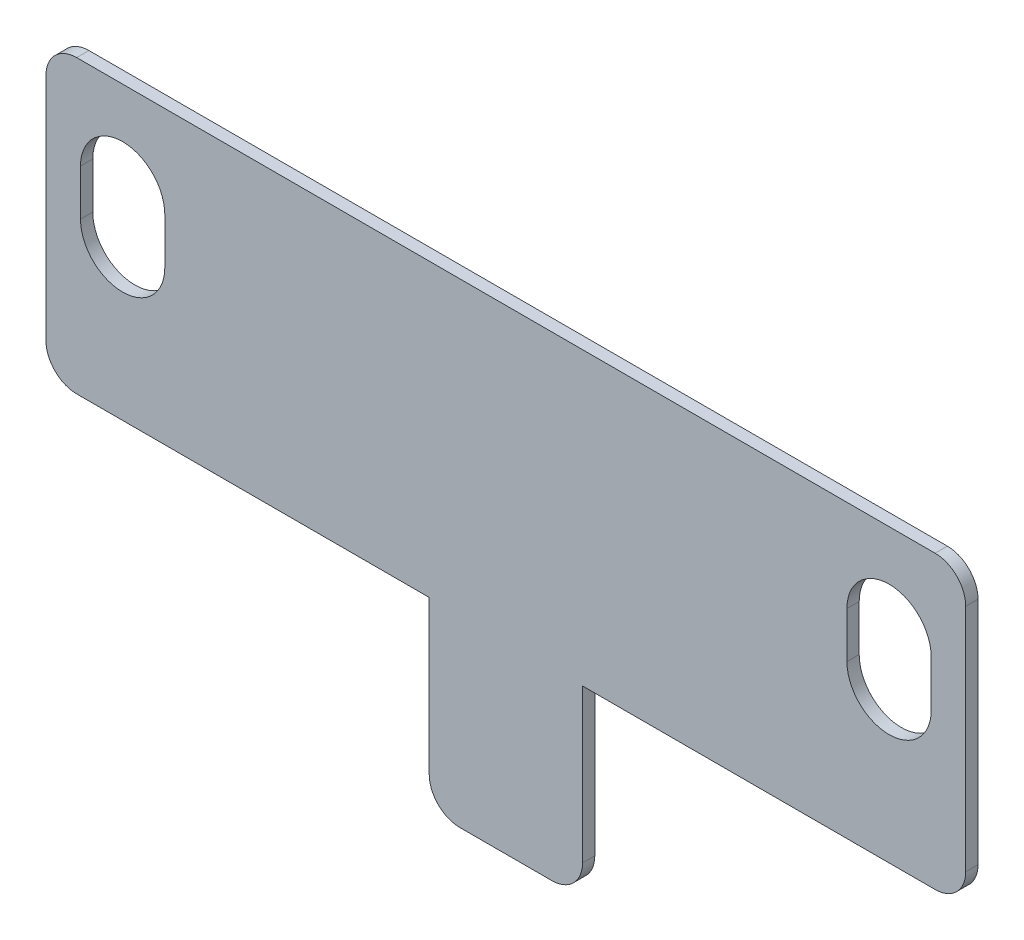
ISO-10303-21;
HEADER;
FILE_DESCRIPTION(('STEP AP214'),'2;1');
FILE_NAME('part.step','',(''),(''),'','','');
FILE_SCHEMA(('AUTOMOTIVE_DESIGN { 1 0 10303 214 1 1 1 1 }'));
ENDSEC;
DATA;
#1=APPLICATION_CONTEXT('core data for automotive mechanical design processes');
#2=APPLICATION_PROTOCOL_DEFINITION('international standard','automotive_design',2000,#1);
#3=PRODUCT_CONTEXT('',#1,'mechanical');
#4=PRODUCT('Part','Part','',(#3));
#5=PRODUCT_RELATED_PRODUCT_CATEGORY('part','',(#4));
#6=PRODUCT_DEFINITION_FORMATION('','',#4);
#7=PRODUCT_DEFINITION_CONTEXT('part definition',#1,'design');
#8=PRODUCT_DEFINITION('design','',#6,#7);
#9=PRODUCT_DEFINITION_SHAPE('','',#8);
#10=(LENGTH_UNIT() NAMED_UNIT(*) SI_UNIT(.MILLI.,.METRE.));
#11=(NAMED_UNIT(*) PLANE_ANGLE_UNIT() SI_UNIT($,.RADIAN.));
#12=(NAMED_UNIT(*) SI_UNIT($,.STERADIAN.) SOLID_ANGLE_UNIT());
#13=UNCERTAINTY_MEASURE_WITH_UNIT(LENGTH_MEASURE(1.E-05),#10,'distance_accuracy_value','');
#14=(GEOMETRIC_REPRESENTATION_CONTEXT(3) GLOBAL_UNCERTAINTY_ASSIGNED_CONTEXT((#13)) GLOBAL_UNIT_ASSIGNED_CONTEXT((#10,
#11,#12)) REPRESENTATION_CONTEXT('',''));
#15=CARTESIAN_POINT('',(0.,0.,0.));
#16=DIRECTION('',(0.,0.,1.));
#17=DIRECTION('',(1.,0.,0.));
#18=AXIS2_PLACEMENT_3D('',#15,#16,#17);
#19=CARTESIAN_POINT('',(-30.,0.,0.8));
#20=DIRECTION('',(1.,0.,0.));
#21=DIRECTION('',(0.,1.,0.));
#22=AXIS2_PLACEMENT_3D('',#19,#20,#21);
#23=PLANE('',#22);
#24=DIRECTION('',(0.,-1.,0.));
#25=VECTOR('',#24,1.);
#26=CARTESIAN_POINT('',(-30.,0.,0.));
#27=LINE('',#26,#25);
#28=CARTESIAN_POINT('',(-30.,-2.,0.));
#29=VERTEX_POINT('',#28);
#30=CARTESIAN_POINT('',(-30.,-17.,0.));
#31=VERTEX_POINT('',#30);
#32=EDGE_CURVE('E287',#29,#31,#27,.T.);
#33=ORIENTED_EDGE('',*,*,#32,.T.);
#34=DIRECTION('',(0.,0.,1.));
#35=VECTOR('',#34,1.);
#36=CARTESIAN_POINT('',(-30.,-17.,0.8));
#37=LINE('',#36,#35);
#38=CARTESIAN_POINT('',(-30.,-17.,0.8));
#39=VERTEX_POINT('',#38);
#40=EDGE_CURVE('E48',#31,#39,#37,.T.);
#41=ORIENTED_EDGE('',*,*,#40,.T.);
#42=DIRECTION('',(0.,-1.,0.));
#43=VECTOR('',#42,1.);
#44=CARTESIAN_POINT('',(-30.,0.,0.8));
#45=LINE('',#44,#43);
#46=CARTESIAN_POINT('',(-30.,-2.,0.8));
#47=VERTEX_POINT('',#46);
#48=EDGE_CURVE('E294',#47,#39,#45,.T.);
#49=ORIENTED_EDGE('',*,*,#48,.F.);
#50=DIRECTION('',(0.,0.,-1.));
#51=VECTOR('',#50,1.);
#52=CARTESIAN_POINT('',(-30.,-2.,0.8));
#53=LINE('',#52,#51);
#54=EDGE_CURVE('E356',#47,#29,#53,.T.);
#55=ORIENTED_EDGE('',*,*,#54,.T.);
#56=EDGE_LOOP('',(#33,#41,#49,#55));
#57=FACE_BOUND('',#56,.T.);
#58=ADVANCED_FACE('F40',(#57),#23,.F.);
#59=CARTESIAN_POINT('',(-30.,-31.,0.8));
#60=DIRECTION('',(0.,1.,0.));
#61=DIRECTION('',(-1.,0.,0.));
#62=AXIS2_PLACEMENT_3D('',#59,#60,#61);
#63=PLANE('',#62);
#64=DIRECTION('',(1.,0.,0.));
#65=VECTOR('',#64,1.);
#66=CARTESIAN_POINT('',(-30.,-31.,0.));
#67=LINE('',#66,#65);
#68=CARTESIAN_POINT('',(-3.,-31.,0.));
#69=VERTEX_POINT('',#68);
#70=CARTESIAN_POINT('',(3.00000000000001,-31.,0.));
#71=VERTEX_POINT('',#70);
#72=EDGE_CURVE('E308',#69,#71,#67,.T.);
#73=ORIENTED_EDGE('',*,*,#72,.T.);
#74=DIRECTION('',(0.,0.,1.));
#75=VECTOR('',#74,1.);
#76=CARTESIAN_POINT('',(3.00000000000001,-31.,0.8));
#77=LINE('',#76,#75);
#78=CARTESIAN_POINT('',(3.00000000000001,-31.,0.8));
#79=VERTEX_POINT('',#78);
#80=EDGE_CURVE('E349',#71,#79,#77,.T.);
#81=ORIENTED_EDGE('',*,*,#80,.T.);
#82=DIRECTION('',(1.,0.,0.));
#83=VECTOR('',#82,1.);
#84=CARTESIAN_POINT('',(-30.,-31.,0.8));
#85=LINE('',#84,#83);
#86=CARTESIAN_POINT('',(-3.,-31.,0.8));
#87=VERTEX_POINT('',#86);
#88=EDGE_CURVE('E297',#87,#79,#85,.T.);
#89=ORIENTED_EDGE('',*,*,#88,.F.);
#90=DIRECTION('',(0.,0.,1.));
#91=VECTOR('',#90,1.);
#92=CARTESIAN_POINT('',(-3.,-31.,0.8));
#93=LINE('',#92,#91);
#94=EDGE_CURVE('E347',#87,#69,#93,.F.);
#95=ORIENTED_EDGE('',*,*,#94,.T.);
#96=EDGE_LOOP('',(#73,#81,#89,#95));
#97=FACE_BOUND('',#96,.T.);
#98=ADVANCED_FACE('F390',(#97),#63,.F.);
#99=CARTESIAN_POINT('',(30.,0.,0.8));
#100=DIRECTION('',(-1.,0.,0.));
#101=DIRECTION('',(0.,-1.,0.));
#102=AXIS2_PLACEMENT_3D('',#99,#100,#101);
#103=PLANE('',#102);
#104=DIRECTION('',(0.,1.,0.));
#105=VECTOR('',#104,1.);
#106=CARTESIAN_POINT('',(30.,0.,0.));
#107=LINE('',#106,#105);
#108=CARTESIAN_POINT('',(30.,-17.,0.));
#109=VERTEX_POINT('',#108);
#110=CARTESIAN_POINT('',(30.,-1.99999999999999,0.));
#111=VERTEX_POINT('',#110);
#112=EDGE_CURVE('E311',#109,#111,#107,.T.);
#113=ORIENTED_EDGE('',*,*,#112,.T.);
#114=DIRECTION('',(0.,0.,-1.));
#115=VECTOR('',#114,1.);
#116=CARTESIAN_POINT('',(30.,-1.99999999999999,0.8));
#117=LINE('',#116,#115);
#118=CARTESIAN_POINT('',(30.,-1.99999999999999,0.8));
#119=VERTEX_POINT('',#118);
#120=EDGE_CURVE('E334',#111,#119,#117,.F.);
#121=ORIENTED_EDGE('',*,*,#120,.T.);
#122=DIRECTION('',(0.,1.,0.));
#123=VECTOR('',#122,1.);
#124=CARTESIAN_POINT('',(30.,0.,0.8));
#125=LINE('',#124,#123);
#126=CARTESIAN_POINT('',(30.,-17.,0.8));
#127=VERTEX_POINT('',#126);
#128=EDGE_CURVE('E300',#127,#119,#125,.T.);
#129=ORIENTED_EDGE('',*,*,#128,.F.);
#130=DIRECTION('',(0.,0.,1.));
#131=VECTOR('',#130,1.);
#132=CARTESIAN_POINT('',(30.,-17.,0.8));
#133=LINE('',#132,#131);
#134=EDGE_CURVE('E332',#127,#109,#133,.F.);
#135=ORIENTED_EDGE('',*,*,#134,.T.);
#136=EDGE_LOOP('',(#113,#121,#129,#135));
#137=FACE_BOUND('',#136,.T.);
#138=ADVANCED_FACE('F409',(#137),#103,.F.);
#139=CARTESIAN_POINT('',(-30.,0.,0.8));
#140=DIRECTION('',(0.,-1.,0.));
#141=DIRECTION('',(1.,0.,0.));
#142=AXIS2_PLACEMENT_3D('',#139,#140,#141);
#143=PLANE('',#142);
#144=DIRECTION('',(-1.,0.,0.));
#145=VECTOR('',#144,1.);
#146=CARTESIAN_POINT('',(-30.,0.,0.8));
#147=LINE('',#146,#145);
#148=CARTESIAN_POINT('',(28.,0.,0.8));
#149=VERTEX_POINT('',#148);
#150=CARTESIAN_POINT('',(-28.,0.,0.8));
#151=VERTEX_POINT('',#150);
#152=EDGE_CURVE('E302',#149,#151,#147,.T.);
#153=ORIENTED_EDGE('',*,*,#152,.F.);
#154=DIRECTION('',(0.,0.,-1.));
#155=VECTOR('',#154,1.);
#156=CARTESIAN_POINT('',(28.,0.,0.8));
#157=LINE('',#156,#155);
#158=CARTESIAN_POINT('',(28.,0.,0.));
#159=VERTEX_POINT('',#158);
#160=EDGE_CURVE('E317',#149,#159,#157,.T.);
#161=ORIENTED_EDGE('',*,*,#160,.T.);
#162=DIRECTION('',(-1.,0.,0.));
#163=VECTOR('',#162,1.);
#164=CARTESIAN_POINT('',(-30.,0.,0.));
#165=LINE('',#164,#163);
#166=CARTESIAN_POINT('',(-28.,0.,0.));
#167=VERTEX_POINT('',#166);
#168=EDGE_CURVE('E298',#159,#167,#165,.T.);
#169=ORIENTED_EDGE('',*,*,#168,.T.);
#170=DIRECTION('',(0.,0.,-1.));
#171=VECTOR('',#170,1.);
#172=CARTESIAN_POINT('',(-28.,0.,0.8));
#173=LINE('',#172,#171);
#174=EDGE_CURVE('E305',#167,#151,#173,.F.);
#175=ORIENTED_EDGE('',*,*,#174,.T.);
#176=EDGE_LOOP('',(#153,#161,#169,#175));
#177=FACE_BOUND('',#176,.T.);
#178=ADVANCED_FACE('F424',(#177),#143,.F.);
#179=CARTESIAN_POINT('',(0.,0.,0.8));
#180=DIRECTION('',(0.,0.,1.));
#181=DIRECTION('',(1.,0.,0.));
#182=AXIS2_PLACEMENT_3D('',#179,#180,#181);
#183=PLANE('',#182);
#184=ORIENTED_EDGE('',*,*,#128,.T.);
#185=CARTESIAN_POINT('',(28.,-1.99999999999999,0.8));
#186=DIRECTION('',(0.,0.,1.));
#187=DIRECTION('',(1.,0.,0.));
#188=AXIS2_PLACEMENT_3D('',#185,#186,#187);
#189=CIRCLE('',#188,2.);
#190=EDGE_CURVE('E344',#119,#149,#189,.T.);
#191=ORIENTED_EDGE('',*,*,#190,.T.);
#192=ORIENTED_EDGE('',*,*,#152,.T.);
#193=CARTESIAN_POINT('',(-28.,-2.,0.8));
#194=DIRECTION('',(0.,0.,1.));
#195=DIRECTION('',(1.,0.,0.));
#196=AXIS2_PLACEMENT_3D('',#193,#194,#195);
#197=CIRCLE('',#196,2.);
#198=EDGE_CURVE('E336',#151,#47,#197,.T.);
#199=ORIENTED_EDGE('',*,*,#198,.T.);
#200=ORIENTED_EDGE('',*,*,#48,.T.);
#201=CARTESIAN_POINT('',(-28.,-17.,0.8));
#202=DIRECTION('',(0.,0.,1.));
#203=DIRECTION('',(1.,0.,0.));
#204=AXIS2_PLACEMENT_3D('',#201,#202,#203);
#205=CIRCLE('',#204,2.);
#206=CARTESIAN_POINT('',(-28.,-19.,0.8));
#207=VERTEX_POINT('',#206);
#208=EDGE_CURVE('E338',#39,#207,#205,.T.);
#209=ORIENTED_EDGE('',*,*,#208,.T.);
#210=DIRECTION('',(-1.,0.,0.));
#211=VECTOR('',#210,1.);
#212=CARTESIAN_POINT('',(-5.,-19.,0.8));
#213=LINE('',#212,#211);
#214=CARTESIAN_POINT('',(-5.,-19.,0.8));
#215=VERTEX_POINT('',#214);
#216=EDGE_CURVE('E220',#215,#207,#213,.T.);
#217=ORIENTED_EDGE('',*,*,#216,.F.);
#218=DIRECTION('',(0.,1.,0.));
#219=VECTOR('',#218,1.);
#220=CARTESIAN_POINT('',(-5.,-31.,0.8));
#221=LINE('',#220,#219);
#222=CARTESIAN_POINT('',(-5.,-29.,0.8));
#223=VERTEX_POINT('',#222);
#224=EDGE_CURVE('E207',#223,#215,#221,.T.);
#225=ORIENTED_EDGE('',*,*,#224,.F.);
#226=CARTESIAN_POINT('',(-3.,-29.,0.8));
#227=DIRECTION('',(0.,0.,1.));
#228=DIRECTION('',(1.,0.,0.));
#229=AXIS2_PLACEMENT_3D('',#226,#227,#228);
#230=CIRCLE('',#229,2.);
#231=EDGE_CURVE('E63',#223,#87,#230,.T.);
#232=ORIENTED_EDGE('',*,*,#231,.T.);
#233=ORIENTED_EDGE('',*,*,#88,.T.);
#234=CARTESIAN_POINT('',(3.00000000000001,-29.,0.8));
#235=DIRECTION('',(0.,0.,1.));
#236=DIRECTION('',(1.,0.,0.));
#237=AXIS2_PLACEMENT_3D('',#234,#235,#236);
#238=CIRCLE('',#237,2.);
#239=CARTESIAN_POINT('',(5.00000000000001,-29.,0.8));
#240=VERTEX_POINT('',#239);
#241=EDGE_CURVE('E55',#79,#240,#238,.T.);
#242=ORIENTED_EDGE('',*,*,#241,.T.);
#243=DIRECTION('',(0.,-1.,0.));
#244=VECTOR('',#243,1.);
#245=CARTESIAN_POINT('',(5.00000000000001,-31.,0.8));
#246=LINE('',#245,#244);
#247=CARTESIAN_POINT('',(5.,-19.,0.8));
#248=VERTEX_POINT('',#247);
#249=EDGE_CURVE('E199',#248,#240,#246,.T.);
#250=ORIENTED_EDGE('',*,*,#249,.F.);
#251=DIRECTION('',(-1.,0.,0.));
#252=VECTOR('',#251,1.);
#253=CARTESIAN_POINT('',(5.,-19.,0.8));
#254=LINE('',#253,#252);
#255=CARTESIAN_POINT('',(28.,-19.,0.8));
#256=VERTEX_POINT('',#255);
#257=EDGE_CURVE('E191',#256,#248,#254,.T.);
#258=ORIENTED_EDGE('',*,*,#257,.F.);
#259=CARTESIAN_POINT('',(28.,-17.,0.8));
#260=DIRECTION('',(0.,0.,1.));
#261=DIRECTION('',(1.,0.,0.));
#262=AXIS2_PLACEMENT_3D('',#259,#260,#261);
#263=CIRCLE('',#262,2.);
#264=EDGE_CURVE('E342',#256,#127,#263,.T.);
#265=ORIENTED_EDGE('',*,*,#264,.T.);
#266=EDGE_LOOP('',(#184,#191,#192,#199,#200,#209,#217,#225,#232,#233,#242,#250,#258,#265));
#267=FACE_BOUND('',#266,.T.);
#268=CARTESIAN_POINT('',(25.,-8.99999999999999,0.8));
#269=DIRECTION('',(0.,0.,1.));
#270=DIRECTION('',(-1.,0.,0.));
#271=AXIS2_PLACEMENT_3D('',#268,#269,#270);
#272=CIRCLE('',#271,2.75);
#273=CARTESIAN_POINT('',(22.25,-8.99999999999999,0.8));
#274=VERTEX_POINT('',#273);
#275=CARTESIAN_POINT('',(27.75,-8.99999999999999,0.8));
#276=VERTEX_POINT('',#275);
#277=EDGE_CURVE('E229',#274,#276,#272,.T.);
#278=ORIENTED_EDGE('',*,*,#277,.F.);
#279=DIRECTION('',(0.,-1.,0.));
#280=VECTOR('',#279,1.);
#281=CARTESIAN_POINT('',(22.25,-8.99999999999999,0.8));
#282=LINE('',#281,#280);
#283=CARTESIAN_POINT('',(22.25,-5.99999999999999,0.8));
#284=VERTEX_POINT('',#283);
#285=EDGE_CURVE('E234',#284,#274,#282,.T.);
#286=ORIENTED_EDGE('',*,*,#285,.F.);
#287=CARTESIAN_POINT('',(25.,-5.99999999999999,0.8));
#288=DIRECTION('',(0.,0.,1.));
#289=DIRECTION('',(-1.,0.,0.));
#290=AXIS2_PLACEMENT_3D('',#287,#288,#289);
#291=CIRCLE('',#290,2.75);
#292=CARTESIAN_POINT('',(27.75,-5.99999999999999,0.8));
#293=VERTEX_POINT('',#292);
#294=EDGE_CURVE('E248',#293,#284,#291,.T.);
#295=ORIENTED_EDGE('',*,*,#294,.F.);
#296=DIRECTION('',(0.,1.,0.));
#297=VECTOR('',#296,1.);
#298=CARTESIAN_POINT('',(27.75,-8.99999999999999,0.8));
#299=LINE('',#298,#297);
#300=EDGE_CURVE('E245',#276,#293,#299,.T.);
#301=ORIENTED_EDGE('',*,*,#300,.F.);
#302=EDGE_LOOP('',(#278,#286,#295,#301));
#303=FACE_BOUND('',#302,.T.);
#304=CARTESIAN_POINT('',(-25.,-8.99999999999999,0.8));
#305=DIRECTION('',(0.,0.,1.));
#306=DIRECTION('',(1.,0.,0.));
#307=AXIS2_PLACEMENT_3D('',#304,#305,#306);
#308=CIRCLE('',#307,2.75);
#309=CARTESIAN_POINT('',(-27.75,-8.99999999999999,0.8));
#310=VERTEX_POINT('',#309);
#311=CARTESIAN_POINT('',(-22.25,-8.99999999999999,0.8));
#312=VERTEX_POINT('',#311);
#313=EDGE_CURVE('E255',#310,#312,#308,.T.);
#314=ORIENTED_EDGE('',*,*,#313,.F.);
#315=DIRECTION('',(0.,-1.,0.));
#316=VECTOR('',#315,1.);
#317=CARTESIAN_POINT('',(-27.75,-8.99999999999999,0.8));
#318=LINE('',#317,#316);
#319=CARTESIAN_POINT('',(-27.75,-5.99999999999999,0.8));
#320=VERTEX_POINT('',#319);
#321=EDGE_CURVE('E266',#320,#310,#318,.T.);
#322=ORIENTED_EDGE('',*,*,#321,.F.);
#323=CARTESIAN_POINT('',(-25.,-5.99999999999999,0.8));
#324=DIRECTION('',(0.,0.,1.));
#325=DIRECTION('',(1.,0.,0.));
#326=AXIS2_PLACEMENT_3D('',#323,#324,#325);
#327=CIRCLE('',#326,2.75);
#328=CARTESIAN_POINT('',(-22.25,-5.99999999999999,0.8));
#329=VERTEX_POINT('',#328);
#330=EDGE_CURVE('E280',#329,#320,#327,.T.);
#331=ORIENTED_EDGE('',*,*,#330,.F.);
#332=DIRECTION('',(0.,1.,0.));
#333=VECTOR('',#332,1.);
#334=CARTESIAN_POINT('',(-22.25,-8.99999999999999,0.8));
#335=LINE('',#334,#333);
#336=EDGE_CURVE('E277',#312,#329,#335,.T.);
#337=ORIENTED_EDGE('',*,*,#336,.F.);
#338=EDGE_LOOP('',(#314,#322,#331,#337));
#339=FACE_BOUND('',#338,.T.);
#340=ADVANCED_FACE('F210',(#267,#303,#339),#183,.T.);
#341=CARTESIAN_POINT('',(0.,0.,0.));
#342=DIRECTION('',(0.,0.,1.));
#343=DIRECTION('',(1.,0.,0.));
#344=AXIS2_PLACEMENT_3D('',#341,#342,#343);
#345=PLANE('',#344);
#346=DIRECTION('',(0.,-1.,0.));
#347=VECTOR('',#346,1.);
#348=CARTESIAN_POINT('',(22.25,-8.99999999999999,0.));
#349=LINE('',#348,#347);
#350=CARTESIAN_POINT('',(22.25,-5.99999999999999,0.));
#351=VERTEX_POINT('',#350);
#352=CARTESIAN_POINT('',(22.25,-8.99999999999999,0.));
#353=VERTEX_POINT('',#352);
#354=EDGE_CURVE('E240',#351,#353,#349,.T.);
#355=ORIENTED_EDGE('',*,*,#354,.T.);
#356=CARTESIAN_POINT('',(25.,-8.99999999999999,0.));
#357=DIRECTION('',(0.,0.,1.));
#358=DIRECTION('',(-1.,0.,0.));
#359=AXIS2_PLACEMENT_3D('',#356,#357,#358);
#360=CIRCLE('',#359,2.75);
#361=CARTESIAN_POINT('',(27.75,-8.99999999999999,0.));
#362=VERTEX_POINT('',#361);
#363=EDGE_CURVE('E230',#353,#362,#360,.T.);
#364=ORIENTED_EDGE('',*,*,#363,.T.);
#365=DIRECTION('',(0.,1.,0.));
#366=VECTOR('',#365,1.);
#367=CARTESIAN_POINT('',(27.75,-8.99999999999999,0.));
#368=LINE('',#367,#366);
#369=CARTESIAN_POINT('',(27.75,-5.99999999999999,0.));
#370=VERTEX_POINT('',#369);
#371=EDGE_CURVE('E233',#362,#370,#368,.T.);
#372=ORIENTED_EDGE('',*,*,#371,.T.);
#373=CARTESIAN_POINT('',(25.,-5.99999999999999,0.));
#374=DIRECTION('',(0.,0.,1.));
#375=DIRECTION('',(-1.,0.,0.));
#376=AXIS2_PLACEMENT_3D('',#373,#374,#375);
#377=CIRCLE('',#376,2.75);
#378=EDGE_CURVE('E237',#370,#351,#377,.T.);
#379=ORIENTED_EDGE('',*,*,#378,.T.);
#380=EDGE_LOOP('',(#355,#364,#372,#379));
#381=FACE_BOUND('',#380,.T.);
#382=DIRECTION('',(0.,-1.,0.));
#383=VECTOR('',#382,1.);
#384=CARTESIAN_POINT('',(-27.75,-8.99999999999999,0.));
#385=LINE('',#384,#383);
#386=CARTESIAN_POINT('',(-27.75,-5.99999999999999,0.));
#387=VERTEX_POINT('',#386);
#388=CARTESIAN_POINT('',(-27.75,-8.99999999999999,0.));
#389=VERTEX_POINT('',#388);
#390=EDGE_CURVE('E272',#387,#389,#385,.T.);
#391=ORIENTED_EDGE('',*,*,#390,.T.);
#392=CARTESIAN_POINT('',(-25.,-8.99999999999999,0.));
#393=DIRECTION('',(0.,0.,1.));
#394=DIRECTION('',(1.,0.,0.));
#395=AXIS2_PLACEMENT_3D('',#392,#393,#394);
#396=CIRCLE('',#395,2.75);
#397=CARTESIAN_POINT('',(-22.25,-8.99999999999999,0.));
#398=VERTEX_POINT('',#397);
#399=EDGE_CURVE('E262',#389,#398,#396,.T.);
#400=ORIENTED_EDGE('',*,*,#399,.T.);
#401=DIRECTION('',(0.,1.,0.));
#402=VECTOR('',#401,1.);
#403=CARTESIAN_POINT('',(-22.25,-8.99999999999999,0.));
#404=LINE('',#403,#402);
#405=CARTESIAN_POINT('',(-22.25,-5.99999999999999,0.));
#406=VERTEX_POINT('',#405);
#407=EDGE_CURVE('E265',#398,#406,#404,.T.);
#408=ORIENTED_EDGE('',*,*,#407,.T.);
#409=CARTESIAN_POINT('',(-25.,-5.99999999999999,0.));
#410=DIRECTION('',(0.,0.,1.));
#411=DIRECTION('',(1.,0.,0.));
#412=AXIS2_PLACEMENT_3D('',#409,#410,#411);
#413=CIRCLE('',#412,2.75);
#414=EDGE_CURVE('E269',#406,#387,#413,.T.);
#415=ORIENTED_EDGE('',*,*,#414,.T.);
#416=EDGE_LOOP('',(#391,#400,#408,#415));
#417=FACE_BOUND('',#416,.T.);
#418=ORIENTED_EDGE('',*,*,#168,.F.);
#419=CARTESIAN_POINT('',(28.,-1.99999999999999,0.));
#420=DIRECTION('',(0.,0.,1.));
#421=DIRECTION('',(1.,0.,0.));
#422=AXIS2_PLACEMENT_3D('',#419,#420,#421);
#423=CIRCLE('',#422,2.);
#424=EDGE_CURVE('E330',#159,#111,#423,.F.);
#425=ORIENTED_EDGE('',*,*,#424,.T.);
#426=ORIENTED_EDGE('',*,*,#112,.F.);
#427=CARTESIAN_POINT('',(28.,-17.,0.));
#428=DIRECTION('',(0.,0.,1.));
#429=DIRECTION('',(1.,0.,0.));
#430=AXIS2_PLACEMENT_3D('',#427,#428,#429);
#431=CIRCLE('',#430,2.);
#432=CARTESIAN_POINT('',(28.,-19.,0.));
#433=VERTEX_POINT('',#432);
#434=EDGE_CURVE('E328',#109,#433,#431,.F.);
#435=ORIENTED_EDGE('',*,*,#434,.T.);
#436=DIRECTION('',(-1.,0.,0.));
#437=VECTOR('',#436,1.);
#438=CARTESIAN_POINT('',(5.,-19.,0.));
#439=LINE('',#438,#437);
#440=CARTESIAN_POINT('',(5.,-19.,0.));
#441=VERTEX_POINT('',#440);
#442=EDGE_CURVE('E212',#433,#441,#439,.T.);
#443=ORIENTED_EDGE('',*,*,#442,.T.);
#444=DIRECTION('',(0.,-1.,0.));
#445=VECTOR('',#444,1.);
#446=CARTESIAN_POINT('',(5.00000000000001,-31.,0.));
#447=LINE('',#446,#445);
#448=CARTESIAN_POINT('',(5.00000000000001,-29.,0.));
#449=VERTEX_POINT('',#448);
#450=EDGE_CURVE('E206',#441,#449,#447,.T.);
#451=ORIENTED_EDGE('',*,*,#450,.T.);
#452=CARTESIAN_POINT('',(3.00000000000001,-29.,0.));
#453=DIRECTION('',(0.,0.,1.));
#454=DIRECTION('',(1.,0.,0.));
#455=AXIS2_PLACEMENT_3D('',#452,#453,#454);
#456=CIRCLE('',#455,2.);
#457=EDGE_CURVE('E326',#449,#71,#456,.F.);
#458=ORIENTED_EDGE('',*,*,#457,.T.);
#459=ORIENTED_EDGE('',*,*,#72,.F.);
#460=CARTESIAN_POINT('',(-3.,-29.,0.));
#461=DIRECTION('',(0.,0.,1.));
#462=DIRECTION('',(1.,0.,0.));
#463=AXIS2_PLACEMENT_3D('',#460,#461,#462);
#464=CIRCLE('',#463,2.);
#465=CARTESIAN_POINT('',(-5.,-29.,0.));
#466=VERTEX_POINT('',#465);
#467=EDGE_CURVE('E324',#69,#466,#464,.F.);
#468=ORIENTED_EDGE('',*,*,#467,.T.);
#469=DIRECTION('',(0.,1.,0.));
#470=VECTOR('',#469,1.);
#471=CARTESIAN_POINT('',(-5.,-31.,0.));
#472=LINE('',#471,#470);
#473=CARTESIAN_POINT('',(-5.,-19.,0.));
#474=VERTEX_POINT('',#473);
#475=EDGE_CURVE('E217',#466,#474,#472,.T.);
#476=ORIENTED_EDGE('',*,*,#475,.T.);
#477=DIRECTION('',(-1.,0.,0.));
#478=VECTOR('',#477,1.);
#479=CARTESIAN_POINT('',(-5.,-19.,0.));
#480=LINE('',#479,#478);
#481=CARTESIAN_POINT('',(-28.,-19.,0.));
#482=VERTEX_POINT('',#481);
#483=EDGE_CURVE('E219',#474,#482,#480,.T.);
#484=ORIENTED_EDGE('',*,*,#483,.T.);
#485=CARTESIAN_POINT('',(-28.,-17.,0.));
#486=DIRECTION('',(0.,0.,1.));
#487=DIRECTION('',(1.,0.,0.));
#488=AXIS2_PLACEMENT_3D('',#485,#486,#487);
#489=CIRCLE('',#488,2.);
#490=EDGE_CURVE('E322',#482,#31,#489,.F.);
#491=ORIENTED_EDGE('',*,*,#490,.T.);
#492=ORIENTED_EDGE('',*,*,#32,.F.);
#493=CARTESIAN_POINT('',(-28.,-2.,0.));
#494=DIRECTION('',(0.,0.,1.));
#495=DIRECTION('',(1.,0.,0.));
#496=AXIS2_PLACEMENT_3D('',#493,#494,#495);
#497=CIRCLE('',#496,2.);
#498=EDGE_CURVE('E320',#29,#167,#497,.F.);
#499=ORIENTED_EDGE('',*,*,#498,.T.);
#500=EDGE_LOOP('',(#418,#425,#426,#435,#443,#451,#458,#459,#468,#476,#484,#491,#492,#499));
#501=FACE_BOUND('',#500,.T.);
#502=ADVANCED_FACE('F373',(#381,#417,#501),#345,.F.);
#503=CARTESIAN_POINT('',(-25.,-8.99999999999999,0.));
#504=DIRECTION('',(0.,0.,1.));
#505=DIRECTION('',(1.,0.,0.));
#506=AXIS2_PLACEMENT_3D('',#503,#504,#505);
#507=CYLINDRICAL_SURFACE('',#506,2.75);
#508=ORIENTED_EDGE('',*,*,#313,.T.);
#509=DIRECTION('',(0.,0.,1.));
#510=VECTOR('',#509,1.);
#511=CARTESIAN_POINT('',(-22.25,-8.99999999999999,0.));
#512=LINE('',#511,#510);
#513=EDGE_CURVE('E275',#398,#312,#512,.T.);
#514=ORIENTED_EDGE('',*,*,#513,.F.);
#515=ORIENTED_EDGE('',*,*,#399,.F.);
#516=DIRECTION('',(0.,0.,1.));
#517=VECTOR('',#516,1.);
#518=CARTESIAN_POINT('',(-27.75,-8.99999999999999,0.));
#519=LINE('',#518,#517);
#520=EDGE_CURVE('E285',#389,#310,#519,.T.);
#521=ORIENTED_EDGE('',*,*,#520,.T.);
#522=EDGE_LOOP('',(#508,#514,#515,#521));
#523=FACE_BOUND('',#522,.T.);
#524=ADVANCED_FACE('F437',(#523),#507,.F.);
#525=CARTESIAN_POINT('',(-27.75,-8.99999999999999,0.));
#526=DIRECTION('',(-1.,0.,0.));
#527=DIRECTION('',(0.,0.,1.));
#528=AXIS2_PLACEMENT_3D('',#525,#526,#527);
#529=PLANE('',#528);
#530=ORIENTED_EDGE('',*,*,#321,.T.);
#531=ORIENTED_EDGE('',*,*,#520,.F.);
#532=ORIENTED_EDGE('',*,*,#390,.F.);
#533=DIRECTION('',(0.,0.,1.));
#534=VECTOR('',#533,1.);
#535=CARTESIAN_POINT('',(-27.75,-5.99999999999999,0.));
#536=LINE('',#535,#534);
#537=EDGE_CURVE('E288',#387,#320,#536,.T.);
#538=ORIENTED_EDGE('',*,*,#537,.T.);
#539=EDGE_LOOP('',(#530,#531,#532,#538));
#540=FACE_BOUND('',#539,.T.);
#541=ADVANCED_FACE('F443',(#540),#529,.F.);
#542=CARTESIAN_POINT('',(-25.,-5.99999999999999,0.));
#543=DIRECTION('',(0.,0.,1.));
#544=DIRECTION('',(1.,0.,0.));
#545=AXIS2_PLACEMENT_3D('',#542,#543,#544);
#546=CYLINDRICAL_SURFACE('',#545,2.75);
#547=ORIENTED_EDGE('',*,*,#330,.T.);
#548=ORIENTED_EDGE('',*,*,#537,.F.);
#549=ORIENTED_EDGE('',*,*,#414,.F.);
#550=DIRECTION('',(0.,0.,1.));
#551=VECTOR('',#550,1.);
#552=CARTESIAN_POINT('',(-22.25,-5.99999999999999,0.));
#553=LINE('',#552,#551);
#554=EDGE_CURVE('E290',#406,#329,#553,.T.);
#555=ORIENTED_EDGE('',*,*,#554,.T.);
#556=EDGE_LOOP('',(#547,#548,#549,#555));
#557=FACE_BOUND('',#556,.T.);
#558=ADVANCED_FACE('F449',(#557),#546,.F.);
#559=CARTESIAN_POINT('',(-22.25,-8.99999999999999,0.));
#560=DIRECTION('',(1.,0.,0.));
#561=DIRECTION('',(0.,0.,-1.));
#562=AXIS2_PLACEMENT_3D('',#559,#560,#561);
#563=PLANE('',#562);
#564=ORIENTED_EDGE('',*,*,#336,.T.);
#565=ORIENTED_EDGE('',*,*,#554,.F.);
#566=ORIENTED_EDGE('',*,*,#407,.F.);
#567=ORIENTED_EDGE('',*,*,#513,.T.);
#568=EDGE_LOOP('',(#564,#565,#566,#567));
#569=FACE_BOUND('',#568,.T.);
#570=ADVANCED_FACE('F445',(#569),#563,.F.);
#571=CARTESIAN_POINT('',(25.,-8.99999999999999,0.));
#572=DIRECTION('',(0.,0.,1.));
#573=DIRECTION('',(1.,0.,0.));
#574=AXIS2_PLACEMENT_3D('',#571,#572,#573);
#575=CYLINDRICAL_SURFACE('',#574,2.75);
#576=ORIENTED_EDGE('',*,*,#277,.T.);
#577=DIRECTION('',(0.,0.,1.));
#578=VECTOR('',#577,1.);
#579=CARTESIAN_POINT('',(27.75,-8.99999999999999,0.));
#580=LINE('',#579,#578);
#581=EDGE_CURVE('E243',#362,#276,#580,.T.);
#582=ORIENTED_EDGE('',*,*,#581,.F.);
#583=ORIENTED_EDGE('',*,*,#363,.F.);
#584=DIRECTION('',(0.,0.,1.));
#585=VECTOR('',#584,1.);
#586=CARTESIAN_POINT('',(22.25,-8.99999999999999,0.));
#587=LINE('',#586,#585);
#588=EDGE_CURVE('E253',#353,#274,#587,.T.);
#589=ORIENTED_EDGE('',*,*,#588,.T.);
#590=EDGE_LOOP('',(#576,#582,#583,#589));
#591=FACE_BOUND('',#590,.T.);
#592=ADVANCED_FACE('F448',(#591),#575,.F.);
#593=CARTESIAN_POINT('',(22.25,-8.99999999999999,0.));
#594=DIRECTION('',(-1.,0.,0.));
#595=DIRECTION('',(0.,0.,1.));
#596=AXIS2_PLACEMENT_3D('',#593,#594,#595);
#597=PLANE('',#596);
#598=ORIENTED_EDGE('',*,*,#285,.T.);
#599=ORIENTED_EDGE('',*,*,#588,.F.);
#600=ORIENTED_EDGE('',*,*,#354,.F.);
#601=DIRECTION('',(0.,0.,1.));
#602=VECTOR('',#601,1.);
#603=CARTESIAN_POINT('',(22.25,-5.99999999999999,0.));
#604=LINE('',#603,#602);
#605=EDGE_CURVE('E256',#351,#284,#604,.T.);
#606=ORIENTED_EDGE('',*,*,#605,.T.);
#607=EDGE_LOOP('',(#598,#599,#600,#606));
#608=FACE_BOUND('',#607,.T.);
#609=ADVANCED_FACE('F459',(#608),#597,.F.);
#610=CARTESIAN_POINT('',(25.,-5.99999999999999,0.));
#611=DIRECTION('',(0.,0.,1.));
#612=DIRECTION('',(1.,0.,0.));
#613=AXIS2_PLACEMENT_3D('',#610,#611,#612);
#614=CYLINDRICAL_SURFACE('',#613,2.75);
#615=ORIENTED_EDGE('',*,*,#294,.T.);
#616=ORIENTED_EDGE('',*,*,#605,.F.);
#617=ORIENTED_EDGE('',*,*,#378,.F.);
#618=DIRECTION('',(0.,0.,1.));
#619=VECTOR('',#618,1.);
#620=CARTESIAN_POINT('',(27.75,-5.99999999999999,0.));
#621=LINE('',#620,#619);
#622=EDGE_CURVE('E258',#370,#293,#621,.T.);
#623=ORIENTED_EDGE('',*,*,#622,.T.);
#624=EDGE_LOOP('',(#615,#616,#617,#623));
#625=FACE_BOUND('',#624,.T.);
#626=ADVANCED_FACE('F464',(#625),#614,.F.);
#627=CARTESIAN_POINT('',(27.75,-8.99999999999999,0.));
#628=DIRECTION('',(1.,0.,0.));
#629=DIRECTION('',(0.,1.,0.));
#630=AXIS2_PLACEMENT_3D('',#627,#628,#629);
#631=PLANE('',#630);
#632=ORIENTED_EDGE('',*,*,#300,.T.);
#633=ORIENTED_EDGE('',*,*,#622,.F.);
#634=ORIENTED_EDGE('',*,*,#371,.F.);
#635=ORIENTED_EDGE('',*,*,#581,.T.);
#636=EDGE_LOOP('',(#632,#633,#634,#635));
#637=FACE_BOUND('',#636,.T.);
#638=ADVANCED_FACE('F461',(#637),#631,.F.);
#639=CARTESIAN_POINT('',(-5.,-31.,0.));
#640=DIRECTION('',(1.,0.,0.));
#641=DIRECTION('',(0.,0.,-1.));
#642=AXIS2_PLACEMENT_3D('',#639,#640,#641);
#643=PLANE('',#642);
#644=ORIENTED_EDGE('',*,*,#475,.F.);
#645=DIRECTION('',(0.,0.,1.));
#646=VECTOR('',#645,1.);
#647=CARTESIAN_POINT('',(-5.,-29.,0.));
#648=LINE('',#647,#646);
#649=EDGE_CURVE('E353',#466,#223,#648,.T.);
#650=ORIENTED_EDGE('',*,*,#649,.T.);
#651=ORIENTED_EDGE('',*,*,#224,.T.);
#652=DIRECTION('',(0.,0.,1.));
#653=VECTOR('',#652,1.);
#654=CARTESIAN_POINT('',(-5.,-19.,0.));
#655=LINE('',#654,#653);
#656=EDGE_CURVE('E223',#474,#215,#655,.T.);
#657=ORIENTED_EDGE('',*,*,#656,.F.);
#658=EDGE_LOOP('',(#644,#650,#651,#657));
#659=FACE_BOUND('',#658,.T.);
#660=ADVANCED_FACE('F382',(#659),#643,.F.);
#661=CARTESIAN_POINT('',(-5.,-19.,0.));
#662=DIRECTION('',(0.,1.,0.));
#663=DIRECTION('',(-1.,0.,0.));
#664=AXIS2_PLACEMENT_3D('',#661,#662,#663);
#665=PLANE('',#664);
#666=ORIENTED_EDGE('',*,*,#216,.T.);
#667=DIRECTION('',(0.,0.,1.));
#668=VECTOR('',#667,1.);
#669=CARTESIAN_POINT('',(-28.,-19.,0.));
#670=LINE('',#669,#668);
#671=EDGE_CURVE('E11',#207,#482,#670,.F.);
#672=ORIENTED_EDGE('',*,*,#671,.T.);
#673=ORIENTED_EDGE('',*,*,#483,.F.);
#674=ORIENTED_EDGE('',*,*,#656,.T.);
#675=EDGE_LOOP('',(#666,#672,#673,#674));
#676=FACE_BOUND('',#675,.T.);
#677=ADVANCED_FACE('F378',(#676),#665,.F.);
#678=CARTESIAN_POINT('',(5.00000000000001,-31.,0.));
#679=DIRECTION('',(-1.,0.,0.));
#680=DIRECTION('',(0.,-1.,0.));
#681=AXIS2_PLACEMENT_3D('',#678,#679,#680);
#682=PLANE('',#681);
#683=ORIENTED_EDGE('',*,*,#249,.T.);
#684=DIRECTION('',(0.,0.,1.));
#685=VECTOR('',#684,1.);
#686=CARTESIAN_POINT('',(5.00000000000001,-29.,0.));
#687=LINE('',#686,#685);
#688=EDGE_CURVE('E351',#240,#449,#687,.F.);
#689=ORIENTED_EDGE('',*,*,#688,.T.);
#690=ORIENTED_EDGE('',*,*,#450,.F.);
#691=DIRECTION('',(0.,0.,1.));
#692=VECTOR('',#691,1.);
#693=CARTESIAN_POINT('',(5.,-19.,0.));
#694=LINE('',#693,#692);
#695=EDGE_CURVE('E195',#441,#248,#694,.T.);
#696=ORIENTED_EDGE('',*,*,#695,.T.);
#697=EDGE_LOOP('',(#683,#689,#690,#696));
#698=FACE_BOUND('',#697,.T.);
#699=ADVANCED_FACE('F204',(#698),#682,.F.);
#700=CARTESIAN_POINT('',(5.,-19.,0.));
#701=DIRECTION('',(0.,1.,0.));
#702=DIRECTION('',(-1.,0.,0.));
#703=AXIS2_PLACEMENT_3D('',#700,#701,#702);
#704=PLANE('',#703);
#705=ORIENTED_EDGE('',*,*,#442,.F.);
#706=DIRECTION('',(0.,0.,1.));
#707=VECTOR('',#706,1.);
#708=CARTESIAN_POINT('',(28.,-19.,0.));
#709=LINE('',#708,#707);
#710=EDGE_CURVE('E197',#433,#256,#709,.T.);
#711=ORIENTED_EDGE('',*,*,#710,.T.);
#712=ORIENTED_EDGE('',*,*,#257,.T.);
#713=ORIENTED_EDGE('',*,*,#695,.F.);
#714=EDGE_LOOP('',(#705,#711,#712,#713));
#715=FACE_BOUND('',#714,.T.);
#716=ADVANCED_FACE('F194',(#715),#704,.F.);
#717=CARTESIAN_POINT('',(28.,-1.99999999999999,0.8));
#718=DIRECTION('',(0.,0.,-1.));
#719=DIRECTION('',(-1.,0.,0.));
#720=AXIS2_PLACEMENT_3D('',#717,#718,#719);
#721=CYLINDRICAL_SURFACE('',#720,2.);
#722=ORIENTED_EDGE('',*,*,#190,.F.);
#723=ORIENTED_EDGE('',*,*,#120,.F.);
#724=ORIENTED_EDGE('',*,*,#424,.F.);
#725=ORIENTED_EDGE('',*,*,#160,.F.);
#726=EDGE_LOOP('',(#722,#723,#724,#725));
#727=FACE_BOUND('',#726,.T.);
#728=ADVANCED_FACE('F401',(#727),#721,.T.);
#729=CARTESIAN_POINT('',(28.,-17.,0.));
#730=DIRECTION('',(0.,0.,1.));
#731=DIRECTION('',(1.,0.,0.));
#732=AXIS2_PLACEMENT_3D('',#729,#730,#731);
#733=CYLINDRICAL_SURFACE('',#732,2.);
#734=ORIENTED_EDGE('',*,*,#434,.F.);
#735=ORIENTED_EDGE('',*,*,#134,.F.);
#736=ORIENTED_EDGE('',*,*,#264,.F.);
#737=ORIENTED_EDGE('',*,*,#710,.F.);
#738=EDGE_LOOP('',(#734,#735,#736,#737));
#739=FACE_BOUND('',#738,.T.);
#740=ADVANCED_FACE('F394',(#739),#733,.T.);
#741=CARTESIAN_POINT('',(3.00000000000001,-29.,0.8));
#742=DIRECTION('',(0.,0.,1.));
#743=DIRECTION('',(1.,0.,0.));
#744=AXIS2_PLACEMENT_3D('',#741,#742,#743);
#745=CYLINDRICAL_SURFACE('',#744,2.);
#746=ORIENTED_EDGE('',*,*,#457,.F.);
#747=ORIENTED_EDGE('',*,*,#688,.F.);
#748=ORIENTED_EDGE('',*,*,#241,.F.);
#749=ORIENTED_EDGE('',*,*,#80,.F.);
#750=EDGE_LOOP('',(#746,#747,#748,#749));
#751=FACE_BOUND('',#750,.T.);
#752=ADVANCED_FACE('F392',(#751),#745,.T.);
#753=CARTESIAN_POINT('',(-3.,-29.,0.));
#754=DIRECTION('',(0.,0.,1.));
#755=DIRECTION('',(1.,0.,0.));
#756=AXIS2_PLACEMENT_3D('',#753,#754,#755);
#757=CYLINDRICAL_SURFACE('',#756,2.);
#758=ORIENTED_EDGE('',*,*,#467,.F.);
#759=ORIENTED_EDGE('',*,*,#94,.F.);
#760=ORIENTED_EDGE('',*,*,#231,.F.);
#761=ORIENTED_EDGE('',*,*,#649,.F.);
#762=EDGE_LOOP('',(#758,#759,#760,#761));
#763=FACE_BOUND('',#762,.T.);
#764=ADVANCED_FACE('F386',(#763),#757,.T.);
#765=CARTESIAN_POINT('',(-28.,-17.,0.8));
#766=DIRECTION('',(0.,0.,1.));
#767=DIRECTION('',(1.,0.,0.));
#768=AXIS2_PLACEMENT_3D('',#765,#766,#767);
#769=CYLINDRICAL_SURFACE('',#768,2.);
#770=ORIENTED_EDGE('',*,*,#490,.F.);
#771=ORIENTED_EDGE('',*,*,#671,.F.);
#772=ORIENTED_EDGE('',*,*,#208,.F.);
#773=ORIENTED_EDGE('',*,*,#40,.F.);
#774=EDGE_LOOP('',(#770,#771,#772,#773));
#775=FACE_BOUND('',#774,.T.);
#776=ADVANCED_FACE('F376',(#775),#769,.T.);
#777=CARTESIAN_POINT('',(-28.,-2.,0.8));
#778=DIRECTION('',(0.,0.,-1.));
#779=DIRECTION('',(-1.,0.,0.));
#780=AXIS2_PLACEMENT_3D('',#777,#778,#779);
#781=CYLINDRICAL_SURFACE('',#780,2.);
#782=ORIENTED_EDGE('',*,*,#198,.F.);
#783=ORIENTED_EDGE('',*,*,#174,.F.);
#784=ORIENTED_EDGE('',*,*,#498,.F.);
#785=ORIENTED_EDGE('',*,*,#54,.F.);
#786=EDGE_LOOP('',(#782,#783,#784,#785));
#787=FACE_BOUND('',#786,.T.);
#788=ADVANCED_FACE('F42',(#787),#781,.T.);
#789=CLOSED_SHELL('',(#58,#98,#138,#178,#340,#502,#524,#541,#558,#570,#592,#609,#626,#638,#660,
#677,#699,#716,#728,#740,#752,#764,#776,#788));
#790=MANIFOLD_SOLID_BREP('B2',#789);
#791=ADVANCED_BREP_SHAPE_REPRESENTATION('',(#18,#790),#14);
#792=SHAPE_DEFINITION_REPRESENTATION(#9,#791);
ENDSEC;
END-ISO-10303-21;
